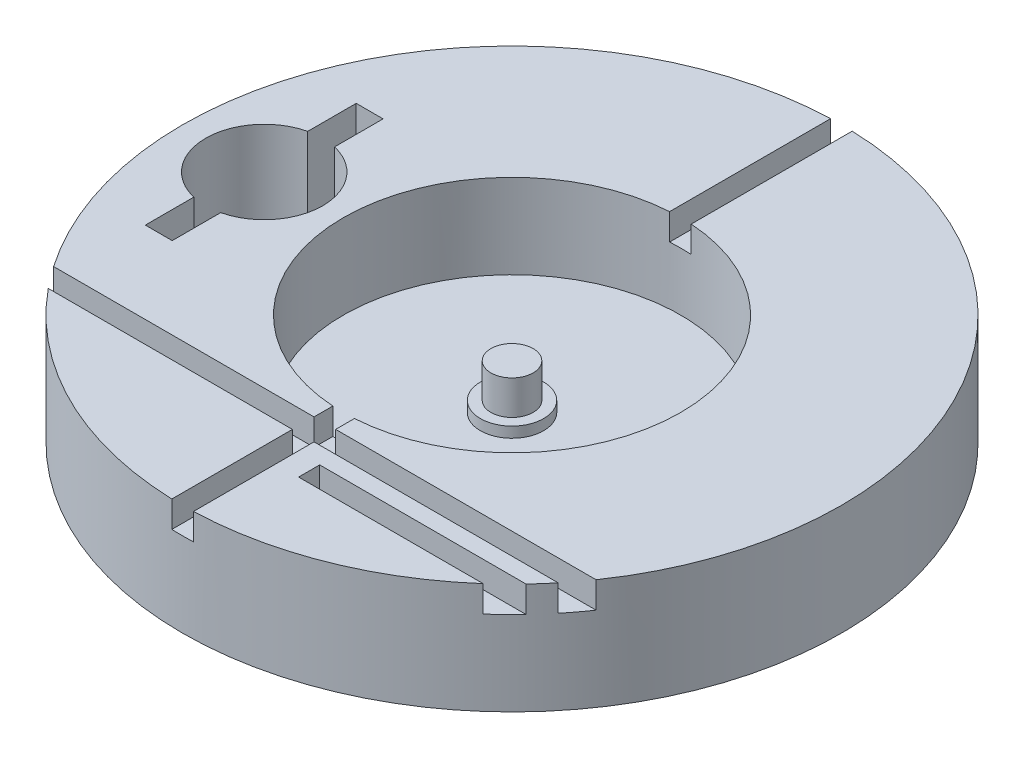
ISO-10303-21;
HEADER;
FILE_DESCRIPTION(('STEP AP214'),'2;1');
FILE_NAME('part.step','',(''),(''),'','','');
FILE_SCHEMA(('AUTOMOTIVE_DESIGN { 1 0 10303 214 1 1 1 1 }'));
ENDSEC;
DATA;
#1=APPLICATION_CONTEXT('core data for automotive mechanical design processes');
#2=APPLICATION_PROTOCOL_DEFINITION('international standard','automotive_design',2000,#1);
#3=PRODUCT_CONTEXT('',#1,'mechanical');
#4=PRODUCT('Part','Part','',(#3));
#5=PRODUCT_RELATED_PRODUCT_CATEGORY('part','',(#4));
#6=PRODUCT_DEFINITION_FORMATION('','',#4);
#7=PRODUCT_DEFINITION_CONTEXT('part definition',#1,'design');
#8=PRODUCT_DEFINITION('design','',#6,#7);
#9=PRODUCT_DEFINITION_SHAPE('','',#8);
#10=(LENGTH_UNIT() NAMED_UNIT(*) SI_UNIT(.MILLI.,.METRE.));
#11=(NAMED_UNIT(*) PLANE_ANGLE_UNIT() SI_UNIT($,.RADIAN.));
#12=(NAMED_UNIT(*) SI_UNIT($,.STERADIAN.) SOLID_ANGLE_UNIT());
#13=UNCERTAINTY_MEASURE_WITH_UNIT(LENGTH_MEASURE(1.E-05),#10,'distance_accuracy_value','');
#14=(GEOMETRIC_REPRESENTATION_CONTEXT(3) GLOBAL_UNCERTAINTY_ASSIGNED_CONTEXT((#13)) GLOBAL_UNIT_ASSIGNED_CONTEXT((#10,
#11,#12)) REPRESENTATION_CONTEXT('',''));
#15=CARTESIAN_POINT('',(0.,0.,0.));
#16=DIRECTION('',(0.,0.,1.));
#17=DIRECTION('',(1.,0.,0.));
#18=AXIS2_PLACEMENT_3D('',#15,#16,#17);
#19=CARTESIAN_POINT('',(0.,21.,0.));
#20=DIRECTION('',(0.,1.,0.));
#21=DIRECTION('',(0.,0.,1.));
#22=AXIS2_PLACEMENT_3D('',#19,#20,#21);
#23=PLANE('',#22);
#24=DIRECTION('',(1.,0.,0.));
#25=VECTOR('',#24,1.);
#26=CARTESIAN_POINT('',(0.,21.,46.8482798010705));
#27=LINE('',#26,#25);
#28=CARTESIAN_POINT('',(6.37014236959566,21.,46.8482798010705));
#29=VERTEX_POINT('',#28);
#30=CARTESIAN_POINT('',(41.3701423695956,21.,46.8482798010705));
#31=VERTEX_POINT('',#30);
#32=EDGE_CURVE('E279',#29,#31,#27,.T.);
#33=ORIENTED_EDGE('',*,*,#32,.F.);
#34=DIRECTION('',(0.,0.,1.));
#35=VECTOR('',#34,1.);
#36=CARTESIAN_POINT('',(6.37014236959566,21.,0.));
#37=LINE('',#36,#35);
#38=CARTESIAN_POINT('',(6.37014236959566,21.,42.8482798010705));
#39=VERTEX_POINT('',#38);
#40=EDGE_CURVE('E293',#39,#29,#37,.T.);
#41=ORIENTED_EDGE('',*,*,#40,.F.);
#42=DIRECTION('',(1.,0.,0.));
#43=VECTOR('',#42,1.);
#44=CARTESIAN_POINT('',(0.,21.,42.8482798010705));
#45=LINE('',#44,#43);
#46=CARTESIAN_POINT('',(45.5002738243318,21.,42.8482798010705));
#47=VERTEX_POINT('',#46);
#48=EDGE_CURVE('E301',#39,#47,#45,.T.);
#49=ORIENTED_EDGE('',*,*,#48,.T.);
#50=CARTESIAN_POINT('',(0.,21.,0.));
#51=DIRECTION('',(0.,1.,0.));
#52=DIRECTION('',(0.,0.,1.));
#53=AXIS2_PLACEMENT_3D('',#50,#51,#52);
#54=CIRCLE('',#53,62.5);
#55=CARTESIAN_POINT('',(48.35,21.,39.6046398796909));
#56=VERTEX_POINT('',#55);
#57=EDGE_CURVE('E404',#47,#56,#54,.T.);
#58=ORIENTED_EDGE('',*,*,#57,.T.);
#59=DIRECTION('',(1.,0.,0.));
#60=VECTOR('',#59,1.);
#61=CARTESIAN_POINT('',(-48.35,21.,39.6046398796909));
#62=LINE('',#61,#60);
#63=CARTESIAN_POINT('',(2.05000000000001,21.,39.6046398796909));
#64=VERTEX_POINT('',#63);
#65=EDGE_CURVE('E330',#64,#56,#62,.T.);
#66=ORIENTED_EDGE('',*,*,#65,.F.);
#67=DIRECTION('',(0.,0.,-1.));
#68=VECTOR('',#67,1.);
#69=CARTESIAN_POINT('',(2.05000000000001,21.,-62.4663709526974));
#70=LINE('',#69,#68);
#71=CARTESIAN_POINT('',(2.05000000000001,21.,62.4663709526974));
#72=VERTEX_POINT('',#71);
#73=EDGE_CURVE('E352',#72,#64,#70,.T.);
#74=ORIENTED_EDGE('',*,*,#73,.F.);
#75=EDGE_CURVE('E400',#72,#31,#54,.T.);
#76=ORIENTED_EDGE('',*,*,#75,.T.);
#77=EDGE_LOOP('',(#33,#41,#49,#58,#66,#74,#76));
#78=FACE_BOUND('',#77,.T.);
#79=ADVANCED_FACE('F33',(#78),#23,.T.);
#80=CARTESIAN_POINT('',(-48.35,21.,39.6046398796908));
#81=VERTEX_POINT('',#80);
#82=CARTESIAN_POINT('',(-2.04999999999999,21.,39.6046398796909));
#83=VERTEX_POINT('',#82);
#84=EDGE_CURVE('E319',#81,#83,#62,.T.);
#85=ORIENTED_EDGE('',*,*,#84,.F.);
#86=CARTESIAN_POINT('',(-2.05000000000002,21.,62.4663709526974));
#87=VERTEX_POINT('',#86);
#88=EDGE_CURVE('E408',#81,#87,#54,.T.);
#89=ORIENTED_EDGE('',*,*,#88,.T.);
#90=DIRECTION('',(0.,0.,1.));
#91=VECTOR('',#90,1.);
#92=CARTESIAN_POINT('',(-2.04999999999999,21.,-62.4663709526974));
#93=LINE('',#92,#91);
#94=EDGE_CURVE('E347',#83,#87,#93,.T.);
#95=ORIENTED_EDGE('',*,*,#94,.F.);
#96=EDGE_LOOP('',(#85,#89,#95));
#97=FACE_BOUND('',#96,.T.);
#98=ADVANCED_FACE('F501',(#97),#23,.T.);
#99=CARTESIAN_POINT('',(-2.04999999999999,16.,-62.4663709526974));
#100=DIRECTION('',(-1.,0.,0.));
#101=DIRECTION('',(0.,0.,1.));
#102=AXIS2_PLACEMENT_3D('',#99,#100,#101);
#103=PLANE('',#102);
#104=DIRECTION('',(0.,0.,1.));
#105=VECTOR('',#104,1.);
#106=CARTESIAN_POINT('',(-2.04999999999999,16.,-62.4663709526974));
#107=LINE('',#106,#105);
#108=CARTESIAN_POINT('',(-2.04999999999999,16.,39.6046398796909));
#109=VERTEX_POINT('',#108);
#110=CARTESIAN_POINT('',(-2.05000000000002,16.,62.4663709526974));
#111=VERTEX_POINT('',#110);
#112=EDGE_CURVE('E351',#109,#111,#107,.T.);
#113=ORIENTED_EDGE('',*,*,#112,.F.);
#114=DIRECTION('',(0.,1.,0.));
#115=VECTOR('',#114,1.);
#116=CARTESIAN_POINT('',(-2.04999999999999,16.,39.6046398796909));
#117=LINE('',#116,#115);
#118=EDGE_CURVE('E344',#109,#83,#117,.T.);
#119=ORIENTED_EDGE('',*,*,#118,.T.);
#120=ORIENTED_EDGE('',*,*,#94,.T.);
#121=DIRECTION('',(0.,1.,0.));
#122=VECTOR('',#121,1.);
#123=CARTESIAN_POINT('',(-2.05000000000002,16.,62.4663709526974));
#124=LINE('',#123,#122);
#125=EDGE_CURVE('E377',#111,#87,#124,.T.);
#126=ORIENTED_EDGE('',*,*,#125,.F.);
#127=EDGE_LOOP('',(#113,#119,#120,#126));
#128=FACE_BOUND('',#127,.T.);
#129=ADVANCED_FACE('F477',(#128),#103,.F.);
#130=CARTESIAN_POINT('',(2.05000000000001,16.,-62.4663709526974));
#131=DIRECTION('',(1.,0.,0.));
#132=DIRECTION('',(0.,0.,-1.));
#133=AXIS2_PLACEMENT_3D('',#130,#131,#132);
#134=PLANE('',#133);
#135=ORIENTED_EDGE('',*,*,#73,.T.);
#136=DIRECTION('',(0.,-1.,0.));
#137=VECTOR('',#136,1.);
#138=CARTESIAN_POINT('',(2.05000000000001,16.,39.6046398796909));
#139=LINE('',#138,#137);
#140=CARTESIAN_POINT('',(2.05000000000001,16.,39.6046398796909));
#141=VERTEX_POINT('',#140);
#142=EDGE_CURVE('E11',#64,#141,#139,.T.);
#143=ORIENTED_EDGE('',*,*,#142,.T.);
#144=DIRECTION('',(0.,0.,-1.));
#145=VECTOR('',#144,1.);
#146=CARTESIAN_POINT('',(2.05000000000001,16.,-62.4663709526974));
#147=LINE('',#146,#145);
#148=CARTESIAN_POINT('',(2.05000000000001,16.,62.4663709526974));
#149=VERTEX_POINT('',#148);
#150=EDGE_CURVE('E359',#149,#141,#147,.T.);
#151=ORIENTED_EDGE('',*,*,#150,.F.);
#152=DIRECTION('',(0.,1.,0.));
#153=VECTOR('',#152,1.);
#154=CARTESIAN_POINT('',(2.05000000000001,16.,62.4663709526974));
#155=LINE('',#154,#153);
#156=EDGE_CURVE('E375',#149,#72,#155,.T.);
#157=ORIENTED_EDGE('',*,*,#156,.T.);
#158=EDGE_LOOP('',(#135,#143,#151,#157));
#159=FACE_BOUND('',#158,.T.);
#160=ADVANCED_FACE('F488',(#159),#134,.F.);
#161=DIRECTION('',(-1.,0.,0.));
#162=VECTOR('',#161,1.);
#163=CARTESIAN_POINT('',(-51.4392845984468,21.,35.5));
#164=LINE('',#163,#162);
#165=CARTESIAN_POINT('',(51.4392845984468,21.,35.5));
#166=VERTEX_POINT('',#165);
#167=CARTESIAN_POINT('',(2.05000000000001,21.,35.5));
#168=VERTEX_POINT('',#167);
#169=EDGE_CURVE('E328',#166,#168,#164,.T.);
#170=ORIENTED_EDGE('',*,*,#169,.F.);
#171=CARTESIAN_POINT('',(2.05000000000001,21.,-62.4663709526974));
#172=VERTEX_POINT('',#171);
#173=EDGE_CURVE('E446',#166,#172,#54,.T.);
#174=ORIENTED_EDGE('',*,*,#173,.T.);
#175=CARTESIAN_POINT('',(2.05000000000001,21.,-31.9342684275059));
#176=VERTEX_POINT('',#175);
#177=EDGE_CURVE('E366',#176,#172,#70,.T.);
#178=ORIENTED_EDGE('',*,*,#177,.F.);
#179=CARTESIAN_POINT('',(0.,21.,0.));
#180=DIRECTION('',(0.,1.,0.));
#181=DIRECTION('',(0.,0.,1.));
#182=AXIS2_PLACEMENT_3D('',#179,#180,#181);
#183=CIRCLE('',#182,32.);
#184=CARTESIAN_POINT('',(2.05000000000001,21.,31.9342684275059));
#185=VERTEX_POINT('',#184);
#186=EDGE_CURVE('E397',#185,#176,#183,.T.);
#187=ORIENTED_EDGE('',*,*,#186,.F.);
#188=EDGE_CURVE('E370',#168,#185,#70,.T.);
#189=ORIENTED_EDGE('',*,*,#188,.F.);
#190=EDGE_LOOP('',(#170,#174,#178,#187,#189));
#191=FACE_BOUND('',#190,.T.);
#192=ADVANCED_FACE('F433',(#191),#23,.T.);
#193=CARTESIAN_POINT('',(0.,7.,0.));
#194=DIRECTION('',(0.,1.,0.));
#195=DIRECTION('',(0.,0.,1.));
#196=AXIS2_PLACEMENT_3D('',#193,#194,#195);
#197=CYLINDRICAL_SURFACE('',#196,4.);
#198=CARTESIAN_POINT('',(0.,7.,0.));
#199=DIRECTION('',(0.,1.,0.));
#200=DIRECTION('',(0.,0.,1.));
#201=AXIS2_PLACEMENT_3D('',#198,#199,#200);
#202=CIRCLE('',#201,4.);
#203=CARTESIAN_POINT('',(0.,7.,4.));
#204=VERTEX_POINT('',#203);
#205=EDGE_CURVE('E383',#204,#204,#202,.T.);
#206=CARTESIAN_POINT('',(0.,13.5,0.));
#207=DIRECTION('',(0.,1.,0.));
#208=DIRECTION('',(0.,0.,1.));
#209=AXIS2_PLACEMENT_3D('',#206,#207,#208);
#210=CIRCLE('',#209,4.);
#211=CARTESIAN_POINT('',(0.,13.5,4.));
#212=VERTEX_POINT('',#211);
#213=EDGE_CURVE('E374',#212,#212,#210,.T.);
#214=CARTESIAN_POINT('',(0.,7.,4.));
#215=CARTESIAN_POINT('',(0.,7.06770833333334,4.));
#216=CARTESIAN_POINT('',(0.,7.13541666666667,4.));
#217=CARTESIAN_POINT('',(0.,7.27083333333334,4.));
#218=CARTESIAN_POINT('',(0.,7.33854166666667,4.));
#219=CARTESIAN_POINT('',(0.,7.47395833333334,4.));
#220=CARTESIAN_POINT('',(0.,7.54166666666667,4.));
#221=CARTESIAN_POINT('',(0.,7.67708333333333,4.));
#222=CARTESIAN_POINT('',(0.,7.74479166666667,4.));
#223=CARTESIAN_POINT('',(0.,7.88020833333333,4.));
#224=CARTESIAN_POINT('',(0.,7.94791666666667,4.));
#225=CARTESIAN_POINT('',(0.,8.08333333333333,4.));
#226=CARTESIAN_POINT('',(0.,8.15104166666667,4.));
#227=CARTESIAN_POINT('',(0.,8.28645833333334,4.));
#228=CARTESIAN_POINT('',(0.,8.35416666666667,4.));
#229=CARTESIAN_POINT('',(0.,8.48958333333334,4.));
#230=CARTESIAN_POINT('',(0.,8.55729166666667,4.));
#231=CARTESIAN_POINT('',(0.,8.69270833333334,4.));
#232=CARTESIAN_POINT('',(0.,8.76041666666667,4.));
#233=CARTESIAN_POINT('',(0.,8.89583333333334,4.));
#234=CARTESIAN_POINT('',(0.,8.96354166666667,4.));
#235=CARTESIAN_POINT('',(0.,9.09895833333333,4.));
#236=CARTESIAN_POINT('',(0.,9.16666666666667,4.));
#237=CARTESIAN_POINT('',(0.,9.30208333333333,4.));
#238=CARTESIAN_POINT('',(0.,9.36979166666667,4.));
#239=CARTESIAN_POINT('',(0.,9.50520833333333,4.));
#240=CARTESIAN_POINT('',(0.,9.57291666666667,4.));
#241=CARTESIAN_POINT('',(0.,9.70833333333333,4.));
#242=CARTESIAN_POINT('',(0.,9.77604166666667,4.));
#243=CARTESIAN_POINT('',(0.,9.91145833333333,4.));
#244=CARTESIAN_POINT('',(0.,9.97916666666667,4.));
#245=CARTESIAN_POINT('',(0.,10.1145833333333,4.));
#246=CARTESIAN_POINT('',(0.,10.1822916666667,4.));
#247=CARTESIAN_POINT('',(0.,10.3177083333333,4.));
#248=CARTESIAN_POINT('',(0.,10.3854166666667,4.));
#249=CARTESIAN_POINT('',(0.,10.5208333333333,4.));
#250=CARTESIAN_POINT('',(0.,10.5885416666667,4.));
#251=CARTESIAN_POINT('',(0.,10.7239583333333,4.));
#252=CARTESIAN_POINT('',(0.,10.7916666666667,4.));
#253=CARTESIAN_POINT('',(0.,10.9270833333333,4.));
#254=CARTESIAN_POINT('',(0.,10.9947916666667,4.));
#255=CARTESIAN_POINT('',(0.,11.1302083333333,4.));
#256=CARTESIAN_POINT('',(0.,11.1979166666667,4.));
#257=CARTESIAN_POINT('',(0.,11.3333333333333,4.));
#258=CARTESIAN_POINT('',(0.,11.4010416666667,4.));
#259=CARTESIAN_POINT('',(0.,11.5364583333333,4.));
#260=CARTESIAN_POINT('',(0.,11.6041666666667,4.));
#261=CARTESIAN_POINT('',(0.,11.7395833333333,4.));
#262=CARTESIAN_POINT('',(0.,11.8072916666667,4.));
#263=CARTESIAN_POINT('',(0.,11.9427083333333,4.));
#264=CARTESIAN_POINT('',(0.,12.0104166666667,4.));
#265=CARTESIAN_POINT('',(0.,12.1458333333333,4.));
#266=CARTESIAN_POINT('',(0.,12.2135416666667,4.));
#267=CARTESIAN_POINT('',(0.,12.3489583333333,4.));
#268=CARTESIAN_POINT('',(0.,12.4166666666667,4.));
#269=CARTESIAN_POINT('',(0.,12.5520833333333,4.));
#270=CARTESIAN_POINT('',(0.,12.6197916666667,4.));
#271=CARTESIAN_POINT('',(0.,12.7552083333333,4.));
#272=CARTESIAN_POINT('',(0.,12.8229166666667,4.));
#273=CARTESIAN_POINT('',(0.,12.9583333333333,4.));
#274=CARTESIAN_POINT('',(0.,13.0260416666667,4.));
#275=CARTESIAN_POINT('',(0.,13.1614583333333,4.));
#276=CARTESIAN_POINT('',(0.,13.2291666666667,4.));
#277=CARTESIAN_POINT('',(0.,13.3645833333333,4.));
#278=CARTESIAN_POINT('',(0.,13.4322916666667,4.));
#279=CARTESIAN_POINT('',(0.,13.5,4.));
#280=B_SPLINE_CURVE_WITH_KNOTS('',3,(#214,#215,#216,#217,#218,#219,#220,#221,#222,#223,#224,
#225,#226,#227,#228,#229,#230,#231,#232,#233,#234,#235,#236,#237,#238,#239,#240,#241,#242,#243,
#244,#245,#246,#247,#248,#249,#250,#251,#252,#253,#254,#255,#256,#257,#258,#259,#260,#261,#262,
#263,#264,#265,#266,#267,#268,#269,#270,#271,#272,#273,#274,#275,#276,#277,#278,#279),
.UNSPECIFIED.,.F.,.F.,(4,2,2,2,2,2,2,2,2,2,2,2,2,2,2,2,2,2,2,2,2,2,2,2,2,2,2,2,2,2,2,2,4),(0.,
0.203124999999999,0.40625,0.609375,0.812499999999999,1.015625,1.21875,1.421875,1.625,1.828125,
2.03125,2.234375,2.4375,2.640625,2.84375,3.046875,3.25,3.453125,3.65625,3.859375,4.0625,
4.265625,4.46875,4.671875,4.875,5.078125,5.28125,5.484375,5.6875,5.890625,6.09375,6.296875,6.5),.UNSPECIFIED.);
#281=EDGE_CURVE('BSEAM539',#204,#212,#280,.T.);
#282=ORIENTED_EDGE('',*,*,#205,.T.);
#283=ORIENTED_EDGE('',*,*,#213,.F.);
#284=ORIENTED_EDGE('',*,*,#281,.T.);
#285=ORIENTED_EDGE('',*,*,#281,.F.);
#286=EDGE_LOOP('',(#282,#284,#283,#285));
#287=FACE_BOUND('',#286,.T.);
#288=ADVANCED_FACE('F539',(#287),#197,.T.);
#289=CARTESIAN_POINT('',(0.,5.,0.));
#290=DIRECTION('',(0.,1.,0.));
#291=DIRECTION('',(0.,0.,1.));
#292=AXIS2_PLACEMENT_3D('',#289,#290,#291);
#293=CYLINDRICAL_SURFACE('',#292,6.);
#294=CARTESIAN_POINT('',(0.,5.,0.));
#295=DIRECTION('',(0.,1.,0.));
#296=DIRECTION('',(0.,0.,1.));
#297=AXIS2_PLACEMENT_3D('',#294,#295,#296);
#298=CIRCLE('',#297,6.);
#299=CARTESIAN_POINT('',(0.,5.,6.));
#300=VERTEX_POINT('',#299);
#301=EDGE_CURVE('E389',#300,#300,#298,.T.);
#302=ORIENTED_EDGE('',*,*,#301,.T.);
#303=EDGE_LOOP('',(#302));
#304=FACE_BOUND('',#303,.T.);
#305=CARTESIAN_POINT('',(0.,7.,0.));
#306=DIRECTION('',(0.,1.,0.));
#307=DIRECTION('',(0.,0.,1.));
#308=AXIS2_PLACEMENT_3D('',#305,#306,#307);
#309=CIRCLE('',#308,6.);
#310=CARTESIAN_POINT('',(0.,7.,6.));
#311=VERTEX_POINT('',#310);
#312=EDGE_CURVE('E386',#311,#311,#309,.T.);
#313=ORIENTED_EDGE('',*,*,#312,.F.);
#314=EDGE_LOOP('',(#313));
#315=FACE_BOUND('',#314,.T.);
#316=ADVANCED_FACE('F537',(#304,#315),#293,.T.);
#317=CARTESIAN_POINT('',(0.,21.,0.));
#318=DIRECTION('',(0.,-1.,0.));
#319=DIRECTION('',(0.,0.,-1.));
#320=AXIS2_PLACEMENT_3D('',#317,#318,#319);
#321=CYLINDRICAL_SURFACE('',#320,62.5);
#322=CARTESIAN_POINT('',(0.,16.,0.));
#323=DIRECTION('',(0.,1.,0.));
#324=DIRECTION('',(0.,0.,1.));
#325=AXIS2_PLACEMENT_3D('',#322,#323,#324);
#326=CIRCLE('',#325,62.5);
#327=CARTESIAN_POINT('',(41.3701423695956,16.,46.8482798010705));
#328=VERTEX_POINT('',#327);
#329=CARTESIAN_POINT('',(45.5002738243318,16.,42.8482798010705));
#330=VERTEX_POINT('',#329);
#331=EDGE_CURVE('E292',#328,#330,#326,.T.);
#332=ORIENTED_EDGE('',*,*,#331,.F.);
#333=DIRECTION('',(0.,1.,0.));
#334=VECTOR('',#333,1.);
#335=CARTESIAN_POINT('',(41.3701423695956,16.,46.8482798010705));
#336=LINE('',#335,#334);
#337=EDGE_CURVE('E299',#328,#31,#336,.T.);
#338=ORIENTED_EDGE('',*,*,#337,.T.);
#339=ORIENTED_EDGE('',*,*,#75,.F.);
#340=ORIENTED_EDGE('',*,*,#156,.F.);
#341=CARTESIAN_POINT('',(0.,16.,0.));
#342=DIRECTION('',(0.,1.,0.));
#343=DIRECTION('',(0.,0.,1.));
#344=AXIS2_PLACEMENT_3D('',#341,#342,#343);
#345=CIRCLE('',#344,62.5);
#346=EDGE_CURVE('E355',#111,#149,#345,.T.);
#347=ORIENTED_EDGE('',*,*,#346,.F.);
#348=ORIENTED_EDGE('',*,*,#125,.T.);
#349=ORIENTED_EDGE('',*,*,#88,.F.);
#350=DIRECTION('',(0.,1.,0.));
#351=VECTOR('',#350,1.);
#352=CARTESIAN_POINT('',(-48.35,16.,39.6046398796908));
#353=LINE('',#352,#351);
#354=CARTESIAN_POINT('',(-48.35,16.,39.6046398796908));
#355=VERTEX_POINT('',#354);
#356=EDGE_CURVE('E336',#355,#81,#353,.T.);
#357=ORIENTED_EDGE('',*,*,#356,.F.);
#358=CARTESIAN_POINT('',(0.,16.,0.));
#359=DIRECTION('',(0.,1.,0.));
#360=DIRECTION('',(0.,0.,1.));
#361=AXIS2_PLACEMENT_3D('',#358,#359,#360);
#362=CIRCLE('',#361,62.5);
#363=CARTESIAN_POINT('',(-51.4392845984468,16.,35.5));
#364=VERTEX_POINT('',#363);
#365=EDGE_CURVE('E322',#364,#355,#362,.T.);
#366=ORIENTED_EDGE('',*,*,#365,.F.);
#367=DIRECTION('',(0.,1.,0.));
#368=VECTOR('',#367,1.);
#369=CARTESIAN_POINT('',(-51.4392845984468,16.,35.5));
#370=LINE('',#369,#368);
#371=CARTESIAN_POINT('',(-51.4392845984468,21.,35.5));
#372=VERTEX_POINT('',#371);
#373=EDGE_CURVE('E338',#364,#372,#370,.T.);
#374=ORIENTED_EDGE('',*,*,#373,.T.);
#375=CARTESIAN_POINT('',(-2.04999999999999,21.,-62.4663709526974));
#376=VERTEX_POINT('',#375);
#377=EDGE_CURVE('E405',#376,#372,#54,.T.);
#378=ORIENTED_EDGE('',*,*,#377,.F.);
#379=DIRECTION('',(0.,1.,0.));
#380=VECTOR('',#379,1.);
#381=CARTESIAN_POINT('',(-2.04999999999999,16.,-62.4663709526974));
#382=LINE('',#381,#380);
#383=CARTESIAN_POINT('',(-2.04999999999999,16.,-62.4663709526974));
#384=VERTEX_POINT('',#383);
#385=EDGE_CURVE('E362',#384,#376,#382,.T.);
#386=ORIENTED_EDGE('',*,*,#385,.F.);
#387=CARTESIAN_POINT('',(0.,16.,0.));
#388=DIRECTION('',(0.,1.,0.));
#389=DIRECTION('',(0.,0.,1.));
#390=AXIS2_PLACEMENT_3D('',#387,#388,#389);
#391=CIRCLE('',#390,62.5);
#392=CARTESIAN_POINT('',(2.05000000000001,16.,-62.4663709526974));
#393=VERTEX_POINT('',#392);
#394=EDGE_CURVE('E348',#393,#384,#391,.T.);
#395=ORIENTED_EDGE('',*,*,#394,.F.);
#396=DIRECTION('',(0.,1.,0.));
#397=VECTOR('',#396,1.);
#398=CARTESIAN_POINT('',(2.05000000000001,16.,-62.4663709526974));
#399=LINE('',#398,#397);
#400=EDGE_CURVE('E371',#393,#172,#399,.T.);
#401=ORIENTED_EDGE('',*,*,#400,.T.);
#402=ORIENTED_EDGE('',*,*,#173,.F.);
#403=DIRECTION('',(0.,1.,0.));
#404=VECTOR('',#403,1.);
#405=CARTESIAN_POINT('',(51.4392845984468,16.,35.5));
#406=LINE('',#405,#404);
#407=CARTESIAN_POINT('',(51.4392845984468,16.,35.5));
#408=VERTEX_POINT('',#407);
#409=EDGE_CURVE('E327',#408,#166,#406,.T.);
#410=ORIENTED_EDGE('',*,*,#409,.F.);
#411=CARTESIAN_POINT('',(0.,16.,0.));
#412=DIRECTION('',(0.,1.,0.));
#413=DIRECTION('',(0.,0.,1.));
#414=AXIS2_PLACEMENT_3D('',#411,#412,#413);
#415=CIRCLE('',#414,62.5);
#416=CARTESIAN_POINT('',(48.35,16.,39.6046398796909));
#417=VERTEX_POINT('',#416);
#418=EDGE_CURVE('E315',#417,#408,#415,.T.);
#419=ORIENTED_EDGE('',*,*,#418,.F.);
#420=DIRECTION('',(0.,1.,0.));
#421=VECTOR('',#420,1.);
#422=CARTESIAN_POINT('',(48.35,16.,39.6046398796909));
#423=LINE('',#422,#421);
#424=EDGE_CURVE('E332',#417,#56,#423,.T.);
#425=ORIENTED_EDGE('',*,*,#424,.T.);
#426=ORIENTED_EDGE('',*,*,#57,.F.);
#427=DIRECTION('',(0.,1.,0.));
#428=VECTOR('',#427,1.);
#429=CARTESIAN_POINT('',(45.5002738243318,16.,42.8482798010705));
#430=LINE('',#429,#428);
#431=EDGE_CURVE('E311',#330,#47,#430,.T.);
#432=ORIENTED_EDGE('',*,*,#431,.F.);
#433=EDGE_LOOP('',(#332,#338,#339,#340,#347,#348,#349,#357,#366,#374,#378,#386,#395,#401,#402,
#410,#419,#425,#426,#432));
#434=FACE_BOUND('',#433,.T.);
#435=CARTESIAN_POINT('',(0.,0.,0.));
#436=DIRECTION('',(0.,1.,0.));
#437=DIRECTION('',(0.,0.,1.));
#438=AXIS2_PLACEMENT_3D('',#435,#436,#437);
#439=CIRCLE('',#438,62.5);
#440=CARTESIAN_POINT('',(0.,0.,62.5));
#441=VERTEX_POINT('',#440);
#442=EDGE_CURVE('E396',#441,#441,#439,.T.);
#443=ORIENTED_EDGE('',*,*,#442,.T.);
#444=EDGE_LOOP('',(#443));
#445=FACE_BOUND('',#444,.T.);
#446=ADVANCED_FACE('F35',(#434,#445),#321,.T.);
#447=DIRECTION('',(0.,0.,-1.));
#448=VECTOR('',#447,1.);
#449=CARTESIAN_POINT('',(-44.45,21.,-10.8031245480185));
#450=LINE('',#449,#448);
#451=CARTESIAN_POINT('',(-44.45,21.,-10.8031245480185));
#452=VERTEX_POINT('',#451);
#453=CARTESIAN_POINT('',(-44.45,21.,-20.));
#454=VERTEX_POINT('',#453);
#455=EDGE_CURVE('E48',#452,#454,#450,.T.);
#456=ORIENTED_EDGE('',*,*,#455,.F.);
#457=CARTESIAN_POINT('',(-47.,21.,0.));
#458=DIRECTION('',(0.,1.,0.));
#459=DIRECTION('',(0.,0.,1.));
#460=AXIS2_PLACEMENT_3D('',#457,#458,#459);
#461=CIRCLE('',#460,11.1);
#462=CARTESIAN_POINT('',(-44.45,21.,10.8031245480185));
#463=VERTEX_POINT('',#462);
#464=EDGE_CURVE('E241',#463,#452,#461,.T.);
#465=ORIENTED_EDGE('',*,*,#464,.F.);
#466=DIRECTION('',(0.,0.,-1.));
#467=VECTOR('',#466,1.);
#468=CARTESIAN_POINT('',(-44.45,21.,20.));
#469=LINE('',#468,#467);
#470=CARTESIAN_POINT('',(-44.45,21.,20.));
#471=VERTEX_POINT('',#470);
#472=EDGE_CURVE('E244',#471,#463,#469,.T.);
#473=ORIENTED_EDGE('',*,*,#472,.F.);
#474=DIRECTION('',(1.,0.,0.));
#475=VECTOR('',#474,1.);
#476=CARTESIAN_POINT('',(-49.55,21.,20.));
#477=LINE('',#476,#475);
#478=CARTESIAN_POINT('',(-49.55,21.,20.));
#479=VERTEX_POINT('',#478);
#480=EDGE_CURVE('E272',#479,#471,#477,.T.);
#481=ORIENTED_EDGE('',*,*,#480,.F.);
#482=DIRECTION('',(0.,0.,1.));
#483=VECTOR('',#482,1.);
#484=CARTESIAN_POINT('',(-49.55,21.,20.));
#485=LINE('',#484,#483);
#486=CARTESIAN_POINT('',(-49.55,21.,10.8031245480185));
#487=VERTEX_POINT('',#486);
#488=EDGE_CURVE('E269',#487,#479,#485,.T.);
#489=ORIENTED_EDGE('',*,*,#488,.F.);
#490=CARTESIAN_POINT('',(-47.,21.,0.));
#491=DIRECTION('',(0.,1.,0.));
#492=DIRECTION('',(0.,0.,1.));
#493=AXIS2_PLACEMENT_3D('',#490,#491,#492);
#494=CIRCLE('',#493,11.1);
#495=CARTESIAN_POINT('',(-49.55,21.,-10.8031245480185));
#496=VERTEX_POINT('',#495);
#497=EDGE_CURVE('E266',#496,#487,#494,.T.);
#498=ORIENTED_EDGE('',*,*,#497,.F.);
#499=DIRECTION('',(0.,0.,1.));
#500=VECTOR('',#499,1.);
#501=CARTESIAN_POINT('',(-49.55,21.,-10.8031245480185));
#502=LINE('',#501,#500);
#503=CARTESIAN_POINT('',(-49.55,21.,-20.));
#504=VERTEX_POINT('',#503);
#505=EDGE_CURVE('E263',#504,#496,#502,.T.);
#506=ORIENTED_EDGE('',*,*,#505,.F.);
#507=DIRECTION('',(-1.,0.,0.));
#508=VECTOR('',#507,1.);
#509=CARTESIAN_POINT('',(-49.55,21.,-20.));
#510=LINE('',#509,#508);
#511=EDGE_CURVE('E261',#454,#504,#510,.T.);
#512=ORIENTED_EDGE('',*,*,#511,.F.);
#513=EDGE_LOOP('',(#456,#465,#473,#481,#489,#498,#506,#512));
#514=FACE_BOUND('',#513,.T.);
#515=CARTESIAN_POINT('',(-2.04999999999999,21.,35.5));
#516=VERTEX_POINT('',#515);
#517=EDGE_CURVE('E308',#516,#372,#164,.T.);
#518=ORIENTED_EDGE('',*,*,#517,.F.);
#519=CARTESIAN_POINT('',(-2.04999999999999,21.,31.9342684275059));
#520=VERTEX_POINT('',#519);
#521=EDGE_CURVE('E367',#520,#516,#93,.T.);
#522=ORIENTED_EDGE('',*,*,#521,.F.);
#523=CARTESIAN_POINT('',(-2.04999999999999,21.,-31.9342684275059));
#524=VERTEX_POINT('',#523);
#525=EDGE_CURVE('E392',#524,#520,#183,.T.);
#526=ORIENTED_EDGE('',*,*,#525,.F.);
#527=EDGE_CURVE('E364',#376,#524,#93,.T.);
#528=ORIENTED_EDGE('',*,*,#527,.F.);
#529=ORIENTED_EDGE('',*,*,#377,.T.);
#530=EDGE_LOOP('',(#518,#522,#526,#528,#529));
#531=FACE_BOUND('',#530,.T.);
#532=ADVANCED_FACE('F469',(#514,#531),#23,.T.);
#533=CARTESIAN_POINT('',(0.,0.,0.));
#534=DIRECTION('',(0.,1.,0.));
#535=DIRECTION('',(0.,0.,1.));
#536=AXIS2_PLACEMENT_3D('',#533,#534,#535);
#537=PLANE('',#536);
#538=ORIENTED_EDGE('',*,*,#442,.F.);
#539=EDGE_LOOP('',(#538));
#540=FACE_BOUND('',#539,.T.);
#541=ADVANCED_FACE('F530',(#540),#537,.F.);
#542=CARTESIAN_POINT('',(0.,5.,0.));
#543=DIRECTION('',(0.,1.,0.));
#544=DIRECTION('',(0.,0.,1.));
#545=AXIS2_PLACEMENT_3D('',#542,#543,#544);
#546=CYLINDRICAL_SURFACE('',#545,32.);
#547=ORIENTED_EDGE('',*,*,#186,.T.);
#548=DIRECTION('',(0.,1.,0.));
#549=VECTOR('',#548,1.);
#550=CARTESIAN_POINT('',(2.05000000000001,5.,-31.9342684275059));
#551=LINE('',#550,#549);
#552=CARTESIAN_POINT('',(2.05000000000001,16.,-31.9342684275059));
#553=VERTEX_POINT('',#552);
#554=EDGE_CURVE('E420',#176,#553,#551,.F.);
#555=ORIENTED_EDGE('',*,*,#554,.T.);
#556=CARTESIAN_POINT('',(0.,16.,0.));
#557=DIRECTION('',(0.,1.,0.));
#558=DIRECTION('',(0.,0.,1.));
#559=AXIS2_PLACEMENT_3D('',#556,#557,#558);
#560=CIRCLE('',#559,32.);
#561=CARTESIAN_POINT('',(-2.04999999999999,16.,-31.9342684275059));
#562=VERTEX_POINT('',#561);
#563=EDGE_CURVE('E411',#562,#553,#560,.F.);
#564=ORIENTED_EDGE('',*,*,#563,.F.);
#565=DIRECTION('',(0.,1.,0.));
#566=VECTOR('',#565,1.);
#567=CARTESIAN_POINT('',(-2.04999999999999,5.,-31.9342684275059));
#568=LINE('',#567,#566);
#569=EDGE_CURVE('E417',#562,#524,#568,.T.);
#570=ORIENTED_EDGE('',*,*,#569,.T.);
#571=ORIENTED_EDGE('',*,*,#525,.T.);
#572=DIRECTION('',(0.,1.,0.));
#573=VECTOR('',#572,1.);
#574=CARTESIAN_POINT('',(-2.04999999999999,5.,31.9342684275059));
#575=LINE('',#574,#573);
#576=CARTESIAN_POINT('',(-2.04999999999999,16.,31.9342684275059));
#577=VERTEX_POINT('',#576);
#578=EDGE_CURVE('E410',#520,#577,#575,.F.);
#579=ORIENTED_EDGE('',*,*,#578,.T.);
#580=CARTESIAN_POINT('',(2.05000000000001,16.,31.9342684275059));
#581=VERTEX_POINT('',#580);
#582=EDGE_CURVE('E403',#581,#577,#560,.F.);
#583=ORIENTED_EDGE('',*,*,#582,.F.);
#584=DIRECTION('',(0.,1.,0.));
#585=VECTOR('',#584,1.);
#586=CARTESIAN_POINT('',(2.05000000000001,5.,31.9342684275059));
#587=LINE('',#586,#585);
#588=EDGE_CURVE('E414',#581,#185,#587,.T.);
#589=ORIENTED_EDGE('',*,*,#588,.T.);
#590=EDGE_LOOP('',(#547,#555,#564,#570,#571,#579,#583,#589));
#591=FACE_BOUND('',#590,.T.);
#592=CARTESIAN_POINT('',(0.,5.,0.));
#593=DIRECTION('',(0.,1.,0.));
#594=DIRECTION('',(0.,0.,1.));
#595=AXIS2_PLACEMENT_3D('',#592,#593,#594);
#596=CIRCLE('',#595,32.);
#597=CARTESIAN_POINT('',(0.,5.,32.));
#598=VERTEX_POINT('',#597);
#599=EDGE_CURVE('E393',#598,#598,#596,.T.);
#600=ORIENTED_EDGE('',*,*,#599,.F.);
#601=EDGE_LOOP('',(#600));
#602=FACE_BOUND('',#601,.T.);
#603=ADVANCED_FACE('F459',(#591,#602),#546,.F.);
#604=CARTESIAN_POINT('',(0.,5.,0.));
#605=DIRECTION('',(0.,1.,0.));
#606=DIRECTION('',(0.,0.,1.));
#607=AXIS2_PLACEMENT_3D('',#604,#605,#606);
#608=PLANE('',#607);
#609=ORIENTED_EDGE('',*,*,#301,.F.);
#610=EDGE_LOOP('',(#609));
#611=FACE_BOUND('',#610,.T.);
#612=ORIENTED_EDGE('',*,*,#599,.T.);
#613=EDGE_LOOP('',(#612));
#614=FACE_BOUND('',#613,.T.);
#615=ADVANCED_FACE('F575',(#611,#614),#608,.T.);
#616=CARTESIAN_POINT('',(0.,7.,0.));
#617=DIRECTION('',(0.,1.,0.));
#618=DIRECTION('',(0.,0.,1.));
#619=AXIS2_PLACEMENT_3D('',#616,#617,#618);
#620=PLANE('',#619);
#621=ORIENTED_EDGE('',*,*,#205,.F.);
#622=EDGE_LOOP('',(#621));
#623=FACE_BOUND('',#622,.T.);
#624=ORIENTED_EDGE('',*,*,#312,.T.);
#625=EDGE_LOOP('',(#624));
#626=FACE_BOUND('',#625,.T.);
#627=ADVANCED_FACE('F570',(#623,#626),#620,.T.);
#628=CARTESIAN_POINT('',(0.,13.5,0.));
#629=DIRECTION('',(0.,1.,0.));
#630=DIRECTION('',(0.,0.,1.));
#631=AXIS2_PLACEMENT_3D('',#628,#629,#630);
#632=PLANE('',#631);
#633=ORIENTED_EDGE('',*,*,#213,.T.);
#634=EDGE_LOOP('',(#633));
#635=FACE_BOUND('',#634,.T.);
#636=ADVANCED_FACE('F566',(#635),#632,.T.);
#637=CARTESIAN_POINT('',(0.,16.,0.));
#638=DIRECTION('',(0.,1.,0.));
#639=DIRECTION('',(0.,0.,1.));
#640=AXIS2_PLACEMENT_3D('',#637,#638,#639);
#641=PLANE('',#640);
#642=CARTESIAN_POINT('',(-2.04999999999999,16.,35.5));
#643=VERTEX_POINT('',#642);
#644=EDGE_CURVE('E356',#577,#643,#107,.T.);
#645=ORIENTED_EDGE('',*,*,#644,.T.);
#646=DIRECTION('',(-1.,0.,0.));
#647=VECTOR('',#646,1.);
#648=CARTESIAN_POINT('',(-51.4392845984468,16.,35.5));
#649=LINE('',#648,#647);
#650=EDGE_CURVE('E318',#643,#364,#649,.T.);
#651=ORIENTED_EDGE('',*,*,#650,.T.);
#652=ORIENTED_EDGE('',*,*,#365,.T.);
#653=DIRECTION('',(1.,0.,0.));
#654=VECTOR('',#653,1.);
#655=CARTESIAN_POINT('',(-48.35,16.,39.6046398796909));
#656=LINE('',#655,#654);
#657=EDGE_CURVE('E325',#355,#109,#656,.T.);
#658=ORIENTED_EDGE('',*,*,#657,.T.);
#659=ORIENTED_EDGE('',*,*,#112,.T.);
#660=ORIENTED_EDGE('',*,*,#346,.T.);
#661=ORIENTED_EDGE('',*,*,#150,.T.);
#662=EDGE_CURVE('E324',#141,#417,#656,.T.);
#663=ORIENTED_EDGE('',*,*,#662,.T.);
#664=ORIENTED_EDGE('',*,*,#418,.T.);
#665=CARTESIAN_POINT('',(2.05000000000001,16.,35.5));
#666=VERTEX_POINT('',#665);
#667=EDGE_CURVE('E320',#408,#666,#649,.T.);
#668=ORIENTED_EDGE('',*,*,#667,.T.);
#669=EDGE_CURVE('E363',#666,#581,#147,.T.);
#670=ORIENTED_EDGE('',*,*,#669,.T.);
#671=ORIENTED_EDGE('',*,*,#582,.T.);
#672=EDGE_LOOP('',(#645,#651,#652,#658,#659,#660,#661,#663,#664,#668,#670,#671));
#673=FACE_BOUND('',#672,.T.);
#674=ADVANCED_FACE('F455',(#673),#641,.T.);
#675=ORIENTED_EDGE('',*,*,#521,.T.);
#676=DIRECTION('',(0.,-1.,0.));
#677=VECTOR('',#676,1.);
#678=CARTESIAN_POINT('',(-2.04999999999999,16.,35.5));
#679=LINE('',#678,#677);
#680=EDGE_CURVE('E335',#516,#643,#679,.T.);
#681=ORIENTED_EDGE('',*,*,#680,.T.);
#682=ORIENTED_EDGE('',*,*,#644,.F.);
#683=ORIENTED_EDGE('',*,*,#578,.F.);
#684=EDGE_LOOP('',(#675,#681,#682,#683));
#685=FACE_BOUND('',#684,.T.);
#686=ADVANCED_FACE('F466',(#685),#103,.F.);
#687=ORIENTED_EDGE('',*,*,#669,.F.);
#688=DIRECTION('',(0.,1.,0.));
#689=VECTOR('',#688,1.);
#690=CARTESIAN_POINT('',(2.05000000000001,16.,35.5));
#691=LINE('',#690,#689);
#692=EDGE_CURVE('E41',#666,#168,#691,.T.);
#693=ORIENTED_EDGE('',*,*,#692,.T.);
#694=ORIENTED_EDGE('',*,*,#188,.T.);
#695=ORIENTED_EDGE('',*,*,#588,.F.);
#696=EDGE_LOOP('',(#687,#693,#694,#695));
#697=FACE_BOUND('',#696,.T.);
#698=ADVANCED_FACE('F427',(#697),#134,.F.);
#699=ORIENTED_EDGE('',*,*,#177,.T.);
#700=ORIENTED_EDGE('',*,*,#400,.F.);
#701=EDGE_CURVE('E358',#553,#393,#147,.T.);
#702=ORIENTED_EDGE('',*,*,#701,.F.);
#703=ORIENTED_EDGE('',*,*,#554,.F.);
#704=EDGE_LOOP('',(#699,#700,#702,#703));
#705=FACE_BOUND('',#704,.T.);
#706=ADVANCED_FACE('F439',(#705),#134,.F.);
#707=EDGE_CURVE('E353',#384,#562,#107,.T.);
#708=ORIENTED_EDGE('',*,*,#707,.F.);
#709=ORIENTED_EDGE('',*,*,#385,.T.);
#710=ORIENTED_EDGE('',*,*,#527,.T.);
#711=ORIENTED_EDGE('',*,*,#569,.F.);
#712=EDGE_LOOP('',(#708,#709,#710,#711));
#713=FACE_BOUND('',#712,.T.);
#714=ADVANCED_FACE('F551',(#713),#103,.F.);
#715=ORIENTED_EDGE('',*,*,#563,.T.);
#716=ORIENTED_EDGE('',*,*,#701,.T.);
#717=ORIENTED_EDGE('',*,*,#394,.T.);
#718=ORIENTED_EDGE('',*,*,#707,.T.);
#719=EDGE_LOOP('',(#715,#716,#717,#718));
#720=FACE_BOUND('',#719,.T.);
#721=ADVANCED_FACE('F450',(#720),#641,.T.);
#722=CARTESIAN_POINT('',(-51.4392845984468,16.,35.5));
#723=DIRECTION('',(0.,0.,-1.));
#724=DIRECTION('',(-1.,0.,0.));
#725=AXIS2_PLACEMENT_3D('',#722,#723,#724);
#726=PLANE('',#725);
#727=ORIENTED_EDGE('',*,*,#667,.F.);
#728=ORIENTED_EDGE('',*,*,#409,.T.);
#729=ORIENTED_EDGE('',*,*,#169,.T.);
#730=ORIENTED_EDGE('',*,*,#692,.F.);
#731=EDGE_LOOP('',(#727,#728,#729,#730));
#732=FACE_BOUND('',#731,.T.);
#733=ADVANCED_FACE('F512',(#732),#726,.F.);
#734=CARTESIAN_POINT('',(-48.35,16.,39.6046398796909));
#735=DIRECTION('',(0.,0.,1.));
#736=DIRECTION('',(1.,0.,0.));
#737=AXIS2_PLACEMENT_3D('',#734,#735,#736);
#738=PLANE('',#737);
#739=ORIENTED_EDGE('',*,*,#65,.T.);
#740=ORIENTED_EDGE('',*,*,#424,.F.);
#741=ORIENTED_EDGE('',*,*,#662,.F.);
#742=ORIENTED_EDGE('',*,*,#142,.F.);
#743=EDGE_LOOP('',(#739,#740,#741,#742));
#744=FACE_BOUND('',#743,.T.);
#745=ADVANCED_FACE('F493',(#744),#738,.F.);
#746=ORIENTED_EDGE('',*,*,#657,.F.);
#747=ORIENTED_EDGE('',*,*,#356,.T.);
#748=ORIENTED_EDGE('',*,*,#84,.T.);
#749=ORIENTED_EDGE('',*,*,#118,.F.);
#750=EDGE_LOOP('',(#746,#747,#748,#749));
#751=FACE_BOUND('',#750,.T.);
#752=ADVANCED_FACE('F504',(#751),#738,.F.);
#753=ORIENTED_EDGE('',*,*,#517,.T.);
#754=ORIENTED_EDGE('',*,*,#373,.F.);
#755=ORIENTED_EDGE('',*,*,#650,.F.);
#756=ORIENTED_EDGE('',*,*,#680,.F.);
#757=EDGE_LOOP('',(#753,#754,#755,#756));
#758=FACE_BOUND('',#757,.T.);
#759=ADVANCED_FACE('F508',(#758),#726,.F.);
#760=CARTESIAN_POINT('',(0.,16.,46.8482798010705));
#761=DIRECTION('',(0.,0.,1.));
#762=DIRECTION('',(1.,0.,0.));
#763=AXIS2_PLACEMENT_3D('',#760,#761,#762);
#764=PLANE('',#763);
#765=ORIENTED_EDGE('',*,*,#32,.T.);
#766=ORIENTED_EDGE('',*,*,#337,.F.);
#767=DIRECTION('',(1.,0.,0.));
#768=VECTOR('',#767,1.);
#769=CARTESIAN_POINT('',(0.,16.,46.8482798010705));
#770=LINE('',#769,#768);
#771=CARTESIAN_POINT('',(6.37014236959566,16.,46.8482798010705));
#772=VERTEX_POINT('',#771);
#773=EDGE_CURVE('E56',#772,#328,#770,.T.);
#774=ORIENTED_EDGE('',*,*,#773,.F.);
#775=DIRECTION('',(0.,1.,0.));
#776=VECTOR('',#775,1.);
#777=CARTESIAN_POINT('',(6.37014236959566,16.,46.8482798010705));
#778=LINE('',#777,#776);
#779=EDGE_CURVE('E306',#772,#29,#778,.T.);
#780=ORIENTED_EDGE('',*,*,#779,.T.);
#781=EDGE_LOOP('',(#765,#766,#774,#780));
#782=FACE_BOUND('',#781,.T.);
#783=ADVANCED_FACE('F510',(#782),#764,.F.);
#784=CARTESIAN_POINT('',(6.37014236959566,16.,0.));
#785=DIRECTION('',(-1.,0.,0.));
#786=DIRECTION('',(0.,0.,1.));
#787=AXIS2_PLACEMENT_3D('',#784,#785,#786);
#788=PLANE('',#787);
#789=ORIENTED_EDGE('',*,*,#40,.T.);
#790=ORIENTED_EDGE('',*,*,#779,.F.);
#791=DIRECTION('',(0.,0.,1.));
#792=VECTOR('',#791,1.);
#793=CARTESIAN_POINT('',(6.37014236959566,16.,0.));
#794=LINE('',#793,#792);
#795=CARTESIAN_POINT('',(6.37014236959566,16.,42.8482798010705));
#796=VERTEX_POINT('',#795);
#797=EDGE_CURVE('E297',#796,#772,#794,.T.);
#798=ORIENTED_EDGE('',*,*,#797,.F.);
#799=DIRECTION('',(0.,1.,0.));
#800=VECTOR('',#799,1.);
#801=CARTESIAN_POINT('',(6.37014236959566,16.,42.8482798010705));
#802=LINE('',#801,#800);
#803=EDGE_CURVE('E309',#796,#39,#802,.T.);
#804=ORIENTED_EDGE('',*,*,#803,.T.);
#805=EDGE_LOOP('',(#789,#790,#798,#804));
#806=FACE_BOUND('',#805,.T.);
#807=ADVANCED_FACE('F517',(#806),#788,.F.);
#808=CARTESIAN_POINT('',(0.,16.,42.8482798010705));
#809=DIRECTION('',(0.,0.,1.));
#810=DIRECTION('',(1.,0.,0.));
#811=AXIS2_PLACEMENT_3D('',#808,#809,#810);
#812=PLANE('',#811);
#813=ORIENTED_EDGE('',*,*,#48,.F.);
#814=ORIENTED_EDGE('',*,*,#803,.F.);
#815=DIRECTION('',(1.,0.,0.));
#816=VECTOR('',#815,1.);
#817=CARTESIAN_POINT('',(0.,16.,42.8482798010705));
#818=LINE('',#817,#816);
#819=EDGE_CURVE('E295',#796,#330,#818,.T.);
#820=ORIENTED_EDGE('',*,*,#819,.T.);
#821=ORIENTED_EDGE('',*,*,#431,.T.);
#822=EDGE_LOOP('',(#813,#814,#820,#821));
#823=FACE_BOUND('',#822,.T.);
#824=ADVANCED_FACE('F687',(#823),#812,.T.);
#825=CARTESIAN_POINT('',(0.,16.,0.));
#826=DIRECTION('',(0.,1.,0.));
#827=DIRECTION('',(0.,0.,1.));
#828=AXIS2_PLACEMENT_3D('',#825,#826,#827);
#829=PLANE('',#828);
#830=ORIENTED_EDGE('',*,*,#773,.T.);
#831=ORIENTED_EDGE('',*,*,#331,.T.);
#832=ORIENTED_EDGE('',*,*,#819,.F.);
#833=ORIENTED_EDGE('',*,*,#797,.T.);
#834=EDGE_LOOP('',(#830,#831,#832,#833));
#835=FACE_BOUND('',#834,.T.);
#836=ADVANCED_FACE('F697',(#835),#829,.T.);
#837=CARTESIAN_POINT('',(-44.45,2.5,-10.8031245480185));
#838=DIRECTION('',(1.,0.,0.));
#839=DIRECTION('',(0.,0.,-1.));
#840=AXIS2_PLACEMENT_3D('',#837,#838,#839);
#841=PLANE('',#840);
#842=ORIENTED_EDGE('',*,*,#455,.T.);
#843=DIRECTION('',(0.,1.,0.));
#844=VECTOR('',#843,1.);
#845=CARTESIAN_POINT('',(-44.45,2.5,-20.));
#846=LINE('',#845,#844);
#847=CARTESIAN_POINT('',(-44.45,2.5,-20.));
#848=VERTEX_POINT('',#847);
#849=EDGE_CURVE('E218',#848,#454,#846,.T.);
#850=ORIENTED_EDGE('',*,*,#849,.F.);
#851=DIRECTION('',(0.,0.,-1.));
#852=VECTOR('',#851,1.);
#853=CARTESIAN_POINT('',(-44.45,2.5,-10.8031245480185));
#854=LINE('',#853,#852);
#855=CARTESIAN_POINT('',(-44.45,2.5,-10.8031245480185));
#856=VERTEX_POINT('',#855);
#857=EDGE_CURVE('E222',#856,#848,#854,.T.);
#858=ORIENTED_EDGE('',*,*,#857,.F.);
#859=DIRECTION('',(0.,1.,0.));
#860=VECTOR('',#859,1.);
#861=CARTESIAN_POINT('',(-44.45,2.5,-10.8031245480185));
#862=LINE('',#861,#860);
#863=EDGE_CURVE('E277',#856,#452,#862,.T.);
#864=ORIENTED_EDGE('',*,*,#863,.T.);
#865=EDGE_LOOP('',(#842,#850,#858,#864));
#866=FACE_BOUND('',#865,.T.);
#867=ADVANCED_FACE('F220',(#866),#841,.F.);
#868=CARTESIAN_POINT('',(-47.,2.5,0.));
#869=DIRECTION('',(0.,1.,0.));
#870=DIRECTION('',(0.,0.,1.));
#871=AXIS2_PLACEMENT_3D('',#868,#869,#870);
#872=CYLINDRICAL_SURFACE('',#871,11.1);
#873=ORIENTED_EDGE('',*,*,#464,.T.);
#874=ORIENTED_EDGE('',*,*,#863,.F.);
#875=CARTESIAN_POINT('',(-47.,2.5,0.));
#876=DIRECTION('',(0.,1.,0.));
#877=DIRECTION('',(0.,0.,1.));
#878=AXIS2_PLACEMENT_3D('',#875,#876,#877);
#879=CIRCLE('',#878,11.1);
#880=CARTESIAN_POINT('',(-44.45,2.5,10.8031245480185));
#881=VERTEX_POINT('',#880);
#882=EDGE_CURVE('E228',#881,#856,#879,.T.);
#883=ORIENTED_EDGE('',*,*,#882,.F.);
#884=DIRECTION('',(0.,1.,0.));
#885=VECTOR('',#884,1.);
#886=CARTESIAN_POINT('',(-44.45,2.5,10.8031245480185));
#887=LINE('',#886,#885);
#888=EDGE_CURVE('E280',#881,#463,#887,.T.);
#889=ORIENTED_EDGE('',*,*,#888,.T.);
#890=EDGE_LOOP('',(#873,#874,#883,#889));
#891=FACE_BOUND('',#890,.T.);
#892=ADVANCED_FACE('F719',(#891),#872,.F.);
#893=CARTESIAN_POINT('',(-44.45,2.5,20.));
#894=DIRECTION('',(1.,0.,0.));
#895=DIRECTION('',(0.,0.,-1.));
#896=AXIS2_PLACEMENT_3D('',#893,#894,#895);
#897=PLANE('',#896);
#898=ORIENTED_EDGE('',*,*,#472,.T.);
#899=ORIENTED_EDGE('',*,*,#888,.F.);
#900=DIRECTION('',(0.,0.,-1.));
#901=VECTOR('',#900,1.);
#902=CARTESIAN_POINT('',(-44.45,2.5,20.));
#903=LINE('',#902,#901);
#904=CARTESIAN_POINT('',(-44.45,2.5,20.));
#905=VERTEX_POINT('',#904);
#906=EDGE_CURVE('E257',#905,#881,#903,.T.);
#907=ORIENTED_EDGE('',*,*,#906,.F.);
#908=DIRECTION('',(0.,1.,0.));
#909=VECTOR('',#908,1.);
#910=CARTESIAN_POINT('',(-44.45,2.5,20.));
#911=LINE('',#910,#909);
#912=EDGE_CURVE('E282',#905,#471,#911,.T.);
#913=ORIENTED_EDGE('',*,*,#912,.T.);
#914=EDGE_LOOP('',(#898,#899,#907,#913));
#915=FACE_BOUND('',#914,.T.);
#916=ADVANCED_FACE('F728',(#915),#897,.F.);
#917=CARTESIAN_POINT('',(-49.55,2.5,20.));
#918=DIRECTION('',(0.,0.,1.));
#919=DIRECTION('',(1.,0.,0.));
#920=AXIS2_PLACEMENT_3D('',#917,#918,#919);
#921=PLANE('',#920);
#922=ORIENTED_EDGE('',*,*,#480,.T.);
#923=ORIENTED_EDGE('',*,*,#912,.F.);
#924=DIRECTION('',(1.,0.,0.));
#925=VECTOR('',#924,1.);
#926=CARTESIAN_POINT('',(-49.55,2.5,20.));
#927=LINE('',#926,#925);
#928=CARTESIAN_POINT('',(-49.55,2.5,20.));
#929=VERTEX_POINT('',#928);
#930=EDGE_CURVE('E254',#929,#905,#927,.T.);
#931=ORIENTED_EDGE('',*,*,#930,.F.);
#932=DIRECTION('',(0.,1.,0.));
#933=VECTOR('',#932,1.);
#934=CARTESIAN_POINT('',(-49.55,2.5,20.));
#935=LINE('',#934,#933);
#936=EDGE_CURVE('E284',#929,#479,#935,.T.);
#937=ORIENTED_EDGE('',*,*,#936,.T.);
#938=EDGE_LOOP('',(#922,#923,#931,#937));
#939=FACE_BOUND('',#938,.T.);
#940=ADVANCED_FACE('F738',(#939),#921,.F.);
#941=CARTESIAN_POINT('',(-49.55,2.5,20.));
#942=DIRECTION('',(-1.,0.,0.));
#943=DIRECTION('',(0.,0.,1.));
#944=AXIS2_PLACEMENT_3D('',#941,#942,#943);
#945=PLANE('',#944);
#946=ORIENTED_EDGE('',*,*,#488,.T.);
#947=ORIENTED_EDGE('',*,*,#936,.F.);
#948=DIRECTION('',(0.,0.,1.));
#949=VECTOR('',#948,1.);
#950=CARTESIAN_POINT('',(-49.55,2.5,20.));
#951=LINE('',#950,#949);
#952=CARTESIAN_POINT('',(-49.55,2.5,10.8031245480185));
#953=VERTEX_POINT('',#952);
#954=EDGE_CURVE('E251',#953,#929,#951,.T.);
#955=ORIENTED_EDGE('',*,*,#954,.F.);
#956=DIRECTION('',(0.,1.,0.));
#957=VECTOR('',#956,1.);
#958=CARTESIAN_POINT('',(-49.55,2.5,10.8031245480185));
#959=LINE('',#958,#957);
#960=EDGE_CURVE('E286',#953,#487,#959,.T.);
#961=ORIENTED_EDGE('',*,*,#960,.T.);
#962=EDGE_LOOP('',(#946,#947,#955,#961));
#963=FACE_BOUND('',#962,.T.);
#964=ADVANCED_FACE('F748',(#963),#945,.F.);
#965=CARTESIAN_POINT('',(-47.,2.5,0.));
#966=DIRECTION('',(0.,1.,0.));
#967=DIRECTION('',(0.,0.,1.));
#968=AXIS2_PLACEMENT_3D('',#965,#966,#967);
#969=CYLINDRICAL_SURFACE('',#968,11.1);
#970=ORIENTED_EDGE('',*,*,#497,.T.);
#971=ORIENTED_EDGE('',*,*,#960,.F.);
#972=CARTESIAN_POINT('',(-47.,2.5,0.));
#973=DIRECTION('',(0.,1.,0.));
#974=DIRECTION('',(0.,0.,1.));
#975=AXIS2_PLACEMENT_3D('',#972,#973,#974);
#976=CIRCLE('',#975,11.1);
#977=CARTESIAN_POINT('',(-49.55,2.5,-10.8031245480185));
#978=VERTEX_POINT('',#977);
#979=EDGE_CURVE('E248',#978,#953,#976,.T.);
#980=ORIENTED_EDGE('',*,*,#979,.F.);
#981=DIRECTION('',(0.,1.,0.));
#982=VECTOR('',#981,1.);
#983=CARTESIAN_POINT('',(-49.55,2.5,-10.8031245480185));
#984=LINE('',#983,#982);
#985=EDGE_CURVE('E288',#978,#496,#984,.T.);
#986=ORIENTED_EDGE('',*,*,#985,.T.);
#987=EDGE_LOOP('',(#970,#971,#980,#986));
#988=FACE_BOUND('',#987,.T.);
#989=ADVANCED_FACE('F758',(#988),#969,.F.);
#990=CARTESIAN_POINT('',(-49.55,2.5,-10.8031245480185));
#991=DIRECTION('',(-1.,0.,0.));
#992=DIRECTION('',(0.,0.,1.));
#993=AXIS2_PLACEMENT_3D('',#990,#991,#992);
#994=PLANE('',#993);
#995=ORIENTED_EDGE('',*,*,#505,.T.);
#996=ORIENTED_EDGE('',*,*,#985,.F.);
#997=DIRECTION('',(0.,0.,1.));
#998=VECTOR('',#997,1.);
#999=CARTESIAN_POINT('',(-49.55,2.5,-10.8031245480185));
#1000=LINE('',#999,#998);
#1001=CARTESIAN_POINT('',(-49.55,2.5,-20.));
#1002=VERTEX_POINT('',#1001);
#1003=EDGE_CURVE('E236',#1002,#978,#1000,.T.);
#1004=ORIENTED_EDGE('',*,*,#1003,.F.);
#1005=DIRECTION('',(0.,1.,0.));
#1006=VECTOR('',#1005,1.);
#1007=CARTESIAN_POINT('',(-49.55,2.5,-20.));
#1008=LINE('',#1007,#1006);
#1009=EDGE_CURVE('E227',#1002,#504,#1008,.T.);
#1010=ORIENTED_EDGE('',*,*,#1009,.T.);
#1011=EDGE_LOOP('',(#995,#996,#1004,#1010));
#1012=FACE_BOUND('',#1011,.T.);
#1013=ADVANCED_FACE('F768',(#1012),#994,.F.);
#1014=CARTESIAN_POINT('',(-49.55,2.5,-20.));
#1015=DIRECTION('',(0.,0.,-1.));
#1016=DIRECTION('',(-1.,0.,0.));
#1017=AXIS2_PLACEMENT_3D('',#1014,#1015,#1016);
#1018=PLANE('',#1017);
#1019=ORIENTED_EDGE('',*,*,#511,.T.);
#1020=ORIENTED_EDGE('',*,*,#1009,.F.);
#1021=DIRECTION('',(-1.,0.,0.));
#1022=VECTOR('',#1021,1.);
#1023=CARTESIAN_POINT('',(-49.55,2.5,-20.));
#1024=LINE('',#1023,#1022);
#1025=EDGE_CURVE('E231',#848,#1002,#1024,.T.);
#1026=ORIENTED_EDGE('',*,*,#1025,.F.);
#1027=ORIENTED_EDGE('',*,*,#849,.T.);
#1028=EDGE_LOOP('',(#1019,#1020,#1026,#1027));
#1029=FACE_BOUND('',#1028,.T.);
#1030=ADVANCED_FACE('F232',(#1029),#1018,.F.);
#1031=CARTESIAN_POINT('',(-47.,2.5,0.));
#1032=DIRECTION('',(0.,1.,0.));
#1033=DIRECTION('',(0.,0.,1.));
#1034=AXIS2_PLACEMENT_3D('',#1031,#1032,#1033);
#1035=PLANE('',#1034);
#1036=ORIENTED_EDGE('',*,*,#857,.T.);
#1037=ORIENTED_EDGE('',*,*,#1025,.T.);
#1038=ORIENTED_EDGE('',*,*,#1003,.T.);
#1039=ORIENTED_EDGE('',*,*,#979,.T.);
#1040=ORIENTED_EDGE('',*,*,#954,.T.);
#1041=ORIENTED_EDGE('',*,*,#930,.T.);
#1042=ORIENTED_EDGE('',*,*,#906,.T.);
#1043=ORIENTED_EDGE('',*,*,#882,.T.);
#1044=EDGE_LOOP('',(#1036,#1037,#1038,#1039,#1040,#1041,#1042,#1043));
#1045=FACE_BOUND('',#1044,.T.);
#1046=ADVANCED_FACE('F238',(#1045),#1035,.T.);
#1047=CLOSED_SHELL('',(#79,#98,#129,#160,#192,#288,#316,#446,#532,#541,#603,#615,#627,#636,#674,
#686,#698,#706,#714,#721,#733,#745,#752,#759,#783,#807,#824,#836,#867,#892,#916,#940,#964,#989,
#1013,#1030,#1046));
#1048=MANIFOLD_SOLID_BREP('B2',#1047);
#1049=ADVANCED_BREP_SHAPE_REPRESENTATION('',(#18,#1048),#14);
#1050=SHAPE_DEFINITION_REPRESENTATION(#9,#1049);
ENDSEC;
END-ISO-10303-21;
